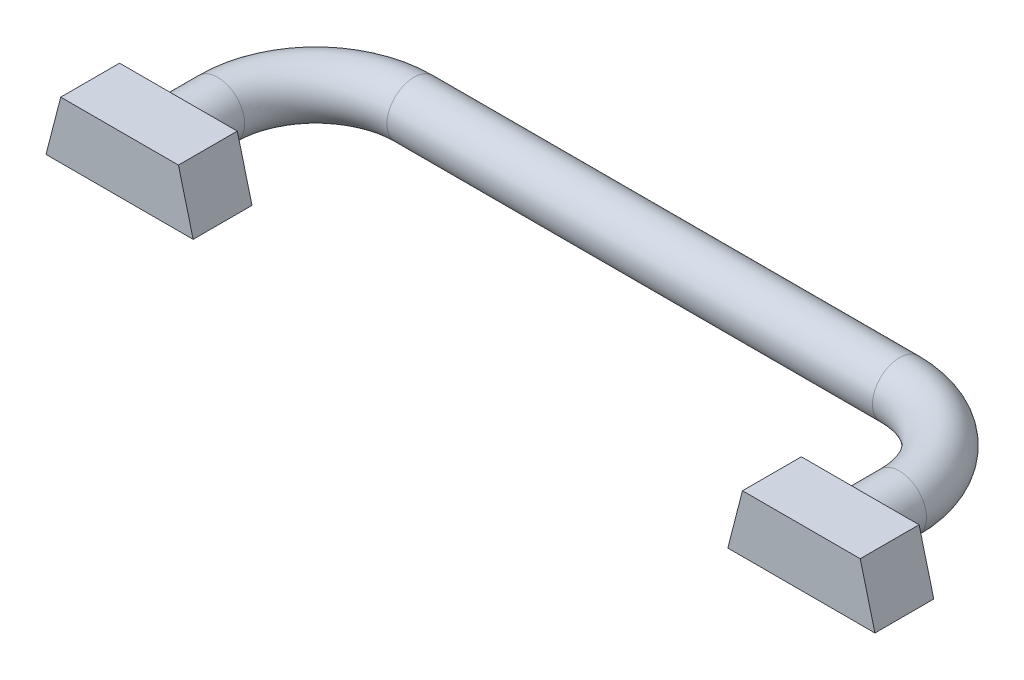
ISO-10303-21;
HEADER;
FILE_DESCRIPTION(('STEP AP214'),'2;1');
FILE_NAME('part.step','',(''),(''),'','','');
FILE_SCHEMA(('AUTOMOTIVE_DESIGN { 1 0 10303 214 1 1 1 1 }'));
ENDSEC;
DATA;
#1=APPLICATION_CONTEXT('core data for automotive mechanical design processes');
#2=APPLICATION_PROTOCOL_DEFINITION('international standard','automotive_design',2000,#1);
#3=PRODUCT_CONTEXT('',#1,'mechanical');
#4=PRODUCT('Part','Part','',(#3));
#5=PRODUCT_RELATED_PRODUCT_CATEGORY('part','',(#4));
#6=PRODUCT_DEFINITION_FORMATION('','',#4);
#7=PRODUCT_DEFINITION_CONTEXT('part definition',#1,'design');
#8=PRODUCT_DEFINITION('design','',#6,#7);
#9=PRODUCT_DEFINITION_SHAPE('','',#8);
#10=(LENGTH_UNIT() NAMED_UNIT(*) SI_UNIT(.MILLI.,.METRE.));
#11=(NAMED_UNIT(*) PLANE_ANGLE_UNIT() SI_UNIT($,.RADIAN.));
#12=(NAMED_UNIT(*) SI_UNIT($,.STERADIAN.) SOLID_ANGLE_UNIT());
#13=UNCERTAINTY_MEASURE_WITH_UNIT(LENGTH_MEASURE(1.E-05),#10,'distance_accuracy_value','');
#14=(GEOMETRIC_REPRESENTATION_CONTEXT(3) GLOBAL_UNCERTAINTY_ASSIGNED_CONTEXT((#13)) GLOBAL_UNIT_ASSIGNED_CONTEXT((#10,
#11,#12)) REPRESENTATION_CONTEXT('',''));
#15=CARTESIAN_POINT('',(0.,0.,0.));
#16=DIRECTION('',(0.,0.,1.));
#17=DIRECTION('',(1.,0.,0.));
#18=AXIS2_PLACEMENT_3D('',#15,#16,#17);
#19=CARTESIAN_POINT('',(0.,0.,0.));
#20=DIRECTION('',(0.,0.,-1.));
#21=DIRECTION('',(-1.,0.,0.));
#22=AXIS2_PLACEMENT_3D('',#19,#20,#21);
#23=CYLINDRICAL_SURFACE('',#22,2.75);
#24=CARTESIAN_POINT('',(0.,0.,-6.));
#25=DIRECTION('',(0.,0.,-1.));
#26=DIRECTION('',(-1.,0.,0.));
#27=AXIS2_PLACEMENT_3D('',#24,#25,#26);
#28=CIRCLE('',#27,2.75);
#29=CARTESIAN_POINT('',(-2.75,0.,-6.));
#30=VERTEX_POINT('',#29);
#31=EDGE_CURVE('E173',#30,#30,#28,.T.);
#32=ORIENTED_EDGE('',*,*,#31,.T.);
#33=EDGE_LOOP('',(#32));
#34=FACE_BOUND('',#33,.T.);
#35=CARTESIAN_POINT('',(0.,0.,-9.99999999999993));
#36=DIRECTION('',(0.,0.,1.));
#37=DIRECTION('',(1.,0.,0.));
#38=AXIS2_PLACEMENT_3D('',#35,#36,#37);
#39=CIRCLE('',#38,2.75);
#40=CARTESIAN_POINT('',(-2.75,0.,-9.99999999999991));
#41=VERTEX_POINT('',#40);
#42=EDGE_CURVE('E178',#41,#41,#39,.T.);
#43=ORIENTED_EDGE('',*,*,#42,.T.);
#44=EDGE_LOOP('',(#43));
#45=FACE_BOUND('',#44,.T.);
#46=ADVANCED_FACE('F34',(#34,#45),#23,.T.);
#47=CARTESIAN_POINT('',(10.,0.,-10.));
#48=DIRECTION('',(0.,-1.,0.));
#49=DIRECTION('',(0.,0.,-1.));
#50=AXIS2_PLACEMENT_3D('',#47,#48,#49);
#51=TOROIDAL_SURFACE('',#50,10.,2.75);
#52=CARTESIAN_POINT('',(10.0000000000001,0.,-20.));
#53=DIRECTION('',(-1.,0.,0.));
#54=DIRECTION('',(0.,0.,1.));
#55=AXIS2_PLACEMENT_3D('',#52,#53,#54);
#56=CIRCLE('',#55,2.75);
#57=CARTESIAN_POINT('',(10.0000000000001,0.,-22.75));
#58=VERTEX_POINT('',#57);
#59=EDGE_CURVE('E181',#58,#58,#56,.T.);
#60=CARTESIAN_POINT('',(10.,0.,-10.));
#61=DIRECTION('',(0.,-1.,0.));
#62=DIRECTION('',(0.,0.,-1.));
#63=AXIS2_PLACEMENT_3D('',#60,#61,#62);
#64=CIRCLE('',#63,12.75);
#65=EDGE_CURVE('',#41,#58,#64,.T.);
#66=ORIENTED_EDGE('',*,*,#42,.F.);
#67=ORIENTED_EDGE('',*,*,#59,.T.);
#68=ORIENTED_EDGE('',*,*,#65,.T.);
#69=ORIENTED_EDGE('',*,*,#65,.F.);
#70=EDGE_LOOP('',(#66,#68,#67,#69));
#71=FACE_BOUND('',#70,.T.);
#72=ADVANCED_FACE('F215',(#71),#51,.T.);
#73=CARTESIAN_POINT('',(10.0000000000001,0.,-20.));
#74=DIRECTION('',(1.,0.,0.));
#75=DIRECTION('',(0.,0.,-1.));
#76=AXIS2_PLACEMENT_3D('',#73,#74,#75);
#77=CYLINDRICAL_SURFACE('',#76,2.75);
#78=CARTESIAN_POINT('',(59.4999999999999,0.,-20.));
#79=DIRECTION('',(-1.,0.,0.));
#80=DIRECTION('',(0.,0.,1.));
#81=AXIS2_PLACEMENT_3D('',#78,#79,#80);
#82=CIRCLE('',#81,2.75);
#83=CARTESIAN_POINT('',(59.4999999999999,0.,-22.75));
#84=VERTEX_POINT('',#83);
#85=EDGE_CURVE('E44',#84,#84,#82,.T.);
#86=ORIENTED_EDGE('',*,*,#85,.T.);
#87=EDGE_LOOP('',(#86));
#88=FACE_BOUND('',#87,.T.);
#89=ORIENTED_EDGE('',*,*,#59,.F.);
#90=EDGE_LOOP('',(#89));
#91=FACE_BOUND('',#90,.T.);
#92=ADVANCED_FACE('F219',(#88,#91),#77,.T.);
#93=CARTESIAN_POINT('',(59.5,0.,-10.));
#94=DIRECTION('',(0.,-1.,0.));
#95=DIRECTION('',(0.,0.,-1.));
#96=AXIS2_PLACEMENT_3D('',#93,#94,#95);
#97=TOROIDAL_SURFACE('',#96,10.,2.75);
#98=CARTESIAN_POINT('',(69.5,0.,-9.99999999999993));
#99=DIRECTION('',(0.,0.,-1.));
#100=DIRECTION('',(-1.,0.,0.));
#101=AXIS2_PLACEMENT_3D('',#98,#99,#100);
#102=CIRCLE('',#101,2.75);
#103=CARTESIAN_POINT('',(72.25,0.,-9.99999999999991));
#104=VERTEX_POINT('',#103);
#105=EDGE_CURVE('E11',#104,#104,#102,.T.);
#106=CARTESIAN_POINT('',(59.5,0.,-10.));
#107=DIRECTION('',(0.,-1.,0.));
#108=DIRECTION('',(0.,0.,-1.));
#109=AXIS2_PLACEMENT_3D('',#106,#107,#108);
#110=CIRCLE('',#109,12.75);
#111=EDGE_CURVE('',#84,#104,#110,.T.);
#112=ORIENTED_EDGE('',*,*,#85,.F.);
#113=ORIENTED_EDGE('',*,*,#105,.T.);
#114=ORIENTED_EDGE('',*,*,#111,.T.);
#115=ORIENTED_EDGE('',*,*,#111,.F.);
#116=EDGE_LOOP('',(#112,#114,#113,#115));
#117=FACE_BOUND('',#116,.T.);
#118=ADVANCED_FACE('F209',(#117),#97,.T.);
#119=CARTESIAN_POINT('',(69.5,0.,-9.99999999999993));
#120=DIRECTION('',(0.,0.,1.));
#121=DIRECTION('',(1.,0.,0.));
#122=AXIS2_PLACEMENT_3D('',#119,#120,#121);
#123=CYLINDRICAL_SURFACE('',#122,2.75);
#124=CARTESIAN_POINT('',(69.5,0.,-6.));
#125=DIRECTION('',(0.,0.,-1.));
#126=DIRECTION('',(-1.,0.,0.));
#127=AXIS2_PLACEMENT_3D('',#124,#125,#126);
#128=CIRCLE('',#127,2.75);
#129=CARTESIAN_POINT('',(66.75,0.,-6.));
#130=VERTEX_POINT('',#129);
#131=EDGE_CURVE('E38',#130,#130,#128,.T.);
#132=ORIENTED_EDGE('',*,*,#131,.T.);
#133=EDGE_LOOP('',(#132));
#134=FACE_BOUND('',#133,.T.);
#135=ORIENTED_EDGE('',*,*,#105,.F.);
#136=EDGE_LOOP('',(#135));
#137=FACE_BOUND('',#136,.T.);
#138=ADVANCED_FACE('F202',(#134,#137),#123,.T.);
#139=CARTESIAN_POINT('',(-7.5,-2.80947501931113,-6.));
#140=DIRECTION('',(-0.968245836551854,0.25,0.));
#141=DIRECTION('',(-0.25,-0.968245836551854,0.));
#142=AXIS2_PLACEMENT_3D('',#139,#140,#141);
#143=PLANE('',#142);
#144=DIRECTION('',(-0.25,-0.968245836551854,0.));
#145=VECTOR('',#144,1.);
#146=CARTESIAN_POINT('',(-7.5,-2.80947501931113,0.));
#147=LINE('',#146,#145);
#148=CARTESIAN_POINT('',(-6.,3.,0.));
#149=VERTEX_POINT('',#148);
#150=CARTESIAN_POINT('',(-7.5,-2.80947501931113,0.));
#151=VERTEX_POINT('',#150);
#152=EDGE_CURVE('E162',#149,#151,#147,.T.);
#153=ORIENTED_EDGE('',*,*,#152,.F.);
#154=DIRECTION('',(0.,0.,1.));
#155=VECTOR('',#154,1.);
#156=CARTESIAN_POINT('',(-6.,3.,-6.));
#157=LINE('',#156,#155);
#158=CARTESIAN_POINT('',(-6.,3.,-6.));
#159=VERTEX_POINT('',#158);
#160=EDGE_CURVE('E53',#159,#149,#157,.T.);
#161=ORIENTED_EDGE('',*,*,#160,.F.);
#162=DIRECTION('',(-0.25,-0.968245836551854,0.));
#163=VECTOR('',#162,1.);
#164=CARTESIAN_POINT('',(-7.5,-2.80947501931113,-6.));
#165=LINE('',#164,#163);
#166=CARTESIAN_POINT('',(-7.5,-2.80947501931113,-6.));
#167=VERTEX_POINT('',#166);
#168=EDGE_CURVE('E153',#159,#167,#165,.T.);
#169=ORIENTED_EDGE('',*,*,#168,.T.);
#170=DIRECTION('',(0.,0.,1.));
#171=VECTOR('',#170,1.);
#172=CARTESIAN_POINT('',(-7.5,-2.80947501931113,-6.));
#173=LINE('',#172,#171);
#174=EDGE_CURVE('E82',#167,#151,#173,.T.);
#175=ORIENTED_EDGE('',*,*,#174,.T.);
#176=EDGE_LOOP('',(#153,#161,#169,#175));
#177=FACE_BOUND('',#176,.T.);
#178=ADVANCED_FACE('F200',(#177),#143,.T.);
#179=CARTESIAN_POINT('',(-6.,3.,-6.));
#180=DIRECTION('',(0.,1.,0.));
#181=DIRECTION('',(0.,0.,1.));
#182=AXIS2_PLACEMENT_3D('',#179,#180,#181);
#183=PLANE('',#182);
#184=DIRECTION('',(-1.,0.,0.));
#185=VECTOR('',#184,1.);
#186=CARTESIAN_POINT('',(-6.,3.,0.));
#187=LINE('',#186,#185);
#188=CARTESIAN_POINT('',(6.,3.,0.));
#189=VERTEX_POINT('',#188);
#190=EDGE_CURVE('E156',#189,#149,#187,.T.);
#191=ORIENTED_EDGE('',*,*,#190,.F.);
#192=DIRECTION('',(0.,0.,1.));
#193=VECTOR('',#192,1.);
#194=CARTESIAN_POINT('',(6.,3.,-6.));
#195=LINE('',#194,#193);
#196=CARTESIAN_POINT('',(6.,3.,-6.));
#197=VERTEX_POINT('',#196);
#198=EDGE_CURVE('E71',#197,#189,#195,.T.);
#199=ORIENTED_EDGE('',*,*,#198,.F.);
#200=DIRECTION('',(-1.,0.,0.));
#201=VECTOR('',#200,1.);
#202=CARTESIAN_POINT('',(-6.,3.,-6.));
#203=LINE('',#202,#201);
#204=EDGE_CURVE('E160',#197,#159,#203,.T.);
#205=ORIENTED_EDGE('',*,*,#204,.T.);
#206=ORIENTED_EDGE('',*,*,#160,.T.);
#207=EDGE_LOOP('',(#191,#199,#205,#206));
#208=FACE_BOUND('',#207,.T.);
#209=ADVANCED_FACE('F197',(#208),#183,.T.);
#210=CARTESIAN_POINT('',(6.,3.,-6.));
#211=DIRECTION('',(0.968245836551854,0.25,0.));
#212=DIRECTION('',(-0.25,0.968245836551854,0.));
#213=AXIS2_PLACEMENT_3D('',#210,#211,#212);
#214=PLANE('',#213);
#215=DIRECTION('',(-0.25,0.968245836551854,0.));
#216=VECTOR('',#215,1.);
#217=CARTESIAN_POINT('',(6.,3.,0.));
#218=LINE('',#217,#216);
#219=CARTESIAN_POINT('',(7.5,-2.80947501931113,0.));
#220=VERTEX_POINT('',#219);
#221=EDGE_CURVE('E168',#220,#189,#218,.T.);
#222=ORIENTED_EDGE('',*,*,#221,.F.);
#223=DIRECTION('',(0.,0.,1.));
#224=VECTOR('',#223,1.);
#225=CARTESIAN_POINT('',(7.5,-2.80947501931113,-6.));
#226=LINE('',#225,#224);
#227=CARTESIAN_POINT('',(7.5,-2.80947501931113,-6.));
#228=VERTEX_POINT('',#227);
#229=EDGE_CURVE('E175',#228,#220,#226,.T.);
#230=ORIENTED_EDGE('',*,*,#229,.F.);
#231=DIRECTION('',(-0.25,0.968245836551854,0.));
#232=VECTOR('',#231,1.);
#233=CARTESIAN_POINT('',(6.,3.,-6.));
#234=LINE('',#233,#232);
#235=EDGE_CURVE('E158',#228,#197,#234,.T.);
#236=ORIENTED_EDGE('',*,*,#235,.T.);
#237=ORIENTED_EDGE('',*,*,#198,.T.);
#238=EDGE_LOOP('',(#222,#230,#236,#237));
#239=FACE_BOUND('',#238,.T.);
#240=ADVANCED_FACE('F198',(#239),#214,.T.);
#241=CARTESIAN_POINT('',(7.5,-2.80947501931113,-6.));
#242=DIRECTION('',(0.,-1.,0.));
#243=DIRECTION('',(1.,0.,0.));
#244=AXIS2_PLACEMENT_3D('',#241,#242,#243);
#245=PLANE('',#244);
#246=DIRECTION('',(1.,0.,0.));
#247=VECTOR('',#246,1.);
#248=CARTESIAN_POINT('',(7.5,-2.80947501931113,0.));
#249=LINE('',#248,#247);
#250=EDGE_CURVE('E165',#151,#220,#249,.T.);
#251=ORIENTED_EDGE('',*,*,#250,.F.);
#252=ORIENTED_EDGE('',*,*,#174,.F.);
#253=DIRECTION('',(1.,0.,0.));
#254=VECTOR('',#253,1.);
#255=CARTESIAN_POINT('',(7.5,-2.80947501931113,-6.));
#256=LINE('',#255,#254);
#257=EDGE_CURVE('E155',#167,#228,#256,.T.);
#258=ORIENTED_EDGE('',*,*,#257,.T.);
#259=ORIENTED_EDGE('',*,*,#229,.T.);
#260=EDGE_LOOP('',(#251,#252,#258,#259));
#261=FACE_BOUND('',#260,.T.);
#262=ADVANCED_FACE('F193',(#261),#245,.T.);
#263=CARTESIAN_POINT('',(0.,0.,-6.));
#264=DIRECTION('',(0.,0.,-1.));
#265=DIRECTION('',(-1.,0.,0.));
#266=AXIS2_PLACEMENT_3D('',#263,#264,#265);
#267=PLANE('',#266);
#268=ORIENTED_EDGE('',*,*,#31,.F.);
#269=EDGE_LOOP('',(#268));
#270=FACE_BOUND('',#269,.T.);
#271=ORIENTED_EDGE('',*,*,#168,.F.);
#272=ORIENTED_EDGE('',*,*,#204,.F.);
#273=ORIENTED_EDGE('',*,*,#235,.F.);
#274=ORIENTED_EDGE('',*,*,#257,.F.);
#275=EDGE_LOOP('',(#271,#272,#273,#274));
#276=FACE_BOUND('',#275,.T.);
#277=ADVANCED_FACE('F190',(#270,#276),#267,.T.);
#278=CARTESIAN_POINT('',(0.,0.,0.));
#279=DIRECTION('',(0.,0.,1.));
#280=DIRECTION('',(1.,0.,0.));
#281=AXIS2_PLACEMENT_3D('',#278,#279,#280);
#282=PLANE('',#281);
#283=ORIENTED_EDGE('',*,*,#152,.T.);
#284=ORIENTED_EDGE('',*,*,#250,.T.);
#285=ORIENTED_EDGE('',*,*,#221,.T.);
#286=ORIENTED_EDGE('',*,*,#190,.T.);
#287=EDGE_LOOP('',(#283,#284,#285,#286));
#288=FACE_BOUND('',#287,.T.);
#289=ADVANCED_FACE('F36',(#288),#282,.T.);
#290=CARTESIAN_POINT('',(62.,-2.80947501931113,-6.));
#291=DIRECTION('',(-0.968245836551854,0.25,0.));
#292=DIRECTION('',(-0.25,-0.968245836551854,0.));
#293=AXIS2_PLACEMENT_3D('',#290,#291,#292);
#294=PLANE('',#293);
#295=DIRECTION('',(-0.25,-0.968245836551854,0.));
#296=VECTOR('',#295,1.);
#297=CARTESIAN_POINT('',(62.,-2.80947501931113,0.));
#298=LINE('',#297,#296);
#299=CARTESIAN_POINT('',(63.5,3.,0.));
#300=VERTEX_POINT('',#299);
#301=CARTESIAN_POINT('',(62.,-2.80947501931113,0.));
#302=VERTEX_POINT('',#301);
#303=EDGE_CURVE('E144',#300,#302,#298,.T.);
#304=ORIENTED_EDGE('',*,*,#303,.F.);
#305=DIRECTION('',(0.,0.,1.));
#306=VECTOR('',#305,1.);
#307=CARTESIAN_POINT('',(63.5,3.,-6.));
#308=LINE('',#307,#306);
#309=CARTESIAN_POINT('',(63.5,3.,-6.));
#310=VERTEX_POINT('',#309);
#311=EDGE_CURVE('E135',#310,#300,#308,.T.);
#312=ORIENTED_EDGE('',*,*,#311,.F.);
#313=DIRECTION('',(-0.25,-0.968245836551854,0.));
#314=VECTOR('',#313,1.);
#315=CARTESIAN_POINT('',(62.,-2.80947501931113,-6.));
#316=LINE('',#315,#314);
#317=CARTESIAN_POINT('',(62.,-2.80947501931113,-6.));
#318=VERTEX_POINT('',#317);
#319=EDGE_CURVE('E129',#310,#318,#316,.T.);
#320=ORIENTED_EDGE('',*,*,#319,.T.);
#321=DIRECTION('',(0.,0.,1.));
#322=VECTOR('',#321,1.);
#323=CARTESIAN_POINT('',(62.,-2.80947501931113,-6.));
#324=LINE('',#323,#322);
#325=EDGE_CURVE('E111',#318,#302,#324,.T.);
#326=ORIENTED_EDGE('',*,*,#325,.T.);
#327=EDGE_LOOP('',(#304,#312,#320,#326));
#328=FACE_BOUND('',#327,.T.);
#329=ADVANCED_FACE('F134',(#328),#294,.T.);
#330=CARTESIAN_POINT('',(63.5,3.,-6.));
#331=DIRECTION('',(0.,1.,0.));
#332=DIRECTION('',(0.,0.,1.));
#333=AXIS2_PLACEMENT_3D('',#330,#331,#332);
#334=PLANE('',#333);
#335=DIRECTION('',(-1.,0.,0.));
#336=VECTOR('',#335,1.);
#337=CARTESIAN_POINT('',(63.5,3.,0.));
#338=LINE('',#337,#336);
#339=CARTESIAN_POINT('',(75.5,3.,0.));
#340=VERTEX_POINT('',#339);
#341=EDGE_CURVE('E136',#340,#300,#338,.T.);
#342=ORIENTED_EDGE('',*,*,#341,.F.);
#343=DIRECTION('',(0.,0.,1.));
#344=VECTOR('',#343,1.);
#345=CARTESIAN_POINT('',(75.5,3.,-6.));
#346=LINE('',#345,#344);
#347=CARTESIAN_POINT('',(75.5,3.,-6.));
#348=VERTEX_POINT('',#347);
#349=EDGE_CURVE('E150',#348,#340,#346,.T.);
#350=ORIENTED_EDGE('',*,*,#349,.F.);
#351=DIRECTION('',(-1.,0.,0.));
#352=VECTOR('',#351,1.);
#353=CARTESIAN_POINT('',(63.5,3.,-6.));
#354=LINE('',#353,#352);
#355=EDGE_CURVE('E122',#348,#310,#354,.T.);
#356=ORIENTED_EDGE('',*,*,#355,.T.);
#357=ORIENTED_EDGE('',*,*,#311,.T.);
#358=EDGE_LOOP('',(#342,#350,#356,#357));
#359=FACE_BOUND('',#358,.T.);
#360=ADVANCED_FACE('F239',(#359),#334,.T.);
#361=CARTESIAN_POINT('',(75.5,3.,-6.));
#362=DIRECTION('',(0.968245836551854,0.25,0.));
#363=DIRECTION('',(-0.25,0.968245836551854,0.));
#364=AXIS2_PLACEMENT_3D('',#361,#362,#363);
#365=PLANE('',#364);
#366=DIRECTION('',(-0.25,0.968245836551854,0.));
#367=VECTOR('',#366,1.);
#368=CARTESIAN_POINT('',(75.5,3.,0.));
#369=LINE('',#368,#367);
#370=CARTESIAN_POINT('',(77.,-2.80947501931113,0.));
#371=VERTEX_POINT('',#370);
#372=EDGE_CURVE('E139',#371,#340,#369,.T.);
#373=ORIENTED_EDGE('',*,*,#372,.F.);
#374=DIRECTION('',(0.,0.,1.));
#375=VECTOR('',#374,1.);
#376=CARTESIAN_POINT('',(77.,-2.80947501931113,-6.));
#377=LINE('',#376,#375);
#378=CARTESIAN_POINT('',(77.,-2.80947501931113,-6.));
#379=VERTEX_POINT('',#378);
#380=EDGE_CURVE('E121',#379,#371,#377,.T.);
#381=ORIENTED_EDGE('',*,*,#380,.F.);
#382=DIRECTION('',(-0.25,0.968245836551854,0.));
#383=VECTOR('',#382,1.);
#384=CARTESIAN_POINT('',(75.5,3.,-6.));
#385=LINE('',#384,#383);
#386=EDGE_CURVE('E132',#379,#348,#385,.T.);
#387=ORIENTED_EDGE('',*,*,#386,.T.);
#388=ORIENTED_EDGE('',*,*,#349,.T.);
#389=EDGE_LOOP('',(#373,#381,#387,#388));
#390=FACE_BOUND('',#389,.T.);
#391=ADVANCED_FACE('F241',(#390),#365,.T.);
#392=CARTESIAN_POINT('',(77.,-2.80947501931113,-6.));
#393=DIRECTION('',(0.,-1.,0.));
#394=DIRECTION('',(0.,0.,-1.));
#395=AXIS2_PLACEMENT_3D('',#392,#393,#394);
#396=PLANE('',#395);
#397=DIRECTION('',(1.,0.,0.));
#398=VECTOR('',#397,1.);
#399=CARTESIAN_POINT('',(77.,-2.80947501931113,0.));
#400=LINE('',#399,#398);
#401=EDGE_CURVE('E116',#302,#371,#400,.T.);
#402=ORIENTED_EDGE('',*,*,#401,.F.);
#403=ORIENTED_EDGE('',*,*,#325,.F.);
#404=DIRECTION('',(1.,0.,0.));
#405=VECTOR('',#404,1.);
#406=CARTESIAN_POINT('',(77.,-2.80947501931113,-6.));
#407=LINE('',#406,#405);
#408=EDGE_CURVE('E114',#318,#379,#407,.T.);
#409=ORIENTED_EDGE('',*,*,#408,.T.);
#410=ORIENTED_EDGE('',*,*,#380,.T.);
#411=EDGE_LOOP('',(#402,#403,#409,#410));
#412=FACE_BOUND('',#411,.T.);
#413=ADVANCED_FACE('F113',(#412),#396,.T.);
#414=CARTESIAN_POINT('',(0.,0.,-6.));
#415=DIRECTION('',(0.,0.,-1.));
#416=DIRECTION('',(-1.,0.,0.));
#417=AXIS2_PLACEMENT_3D('',#414,#415,#416);
#418=PLANE('',#417);
#419=ORIENTED_EDGE('',*,*,#131,.F.);
#420=EDGE_LOOP('',(#419));
#421=FACE_BOUND('',#420,.T.);
#422=ORIENTED_EDGE('',*,*,#319,.F.);
#423=ORIENTED_EDGE('',*,*,#355,.F.);
#424=ORIENTED_EDGE('',*,*,#386,.F.);
#425=ORIENTED_EDGE('',*,*,#408,.F.);
#426=EDGE_LOOP('',(#422,#423,#424,#425));
#427=FACE_BOUND('',#426,.T.);
#428=ADVANCED_FACE('F127',(#421,#427),#418,.T.);
#429=CARTESIAN_POINT('',(69.5,0.,0.));
#430=DIRECTION('',(0.,0.,-1.));
#431=DIRECTION('',(-1.,0.,0.));
#432=AXIS2_PLACEMENT_3D('',#429,#430,#431);
#433=PLANE('',#432);
#434=ORIENTED_EDGE('',*,*,#303,.T.);
#435=ORIENTED_EDGE('',*,*,#401,.T.);
#436=ORIENTED_EDGE('',*,*,#372,.T.);
#437=ORIENTED_EDGE('',*,*,#341,.T.);
#438=EDGE_LOOP('',(#434,#435,#436,#437));
#439=FACE_BOUND('',#438,.T.);
#440=ADVANCED_FACE('F228',(#439),#433,.F.);
#441=CLOSED_SHELL('',(#46,#72,#92,#118,#138,#178,#209,#240,#262,#277,#289,#329,#360,#391,#413,
#428,#440));
#442=MANIFOLD_SOLID_BREP('B2',#441);
#443=ADVANCED_BREP_SHAPE_REPRESENTATION('',(#18,#442),#14);
#444=SHAPE_DEFINITION_REPRESENTATION(#9,#443);
ENDSEC;
END-ISO-10303-21;
